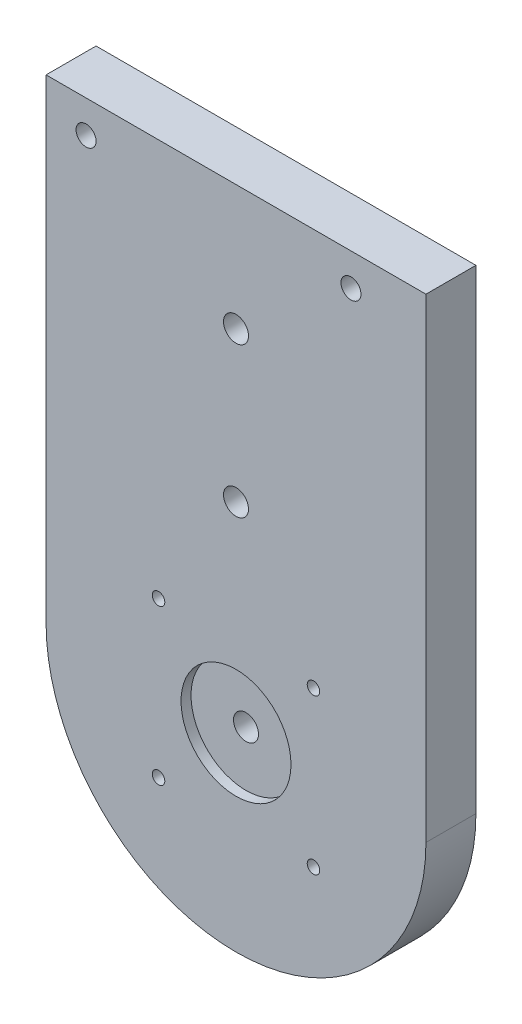
ISO-10303-21;
HEADER;
FILE_DESCRIPTION(('STEP AP214'),'2;1');
FILE_NAME('part.step','',(''),(''),'','','');
FILE_SCHEMA(('AUTOMOTIVE_DESIGN { 1 0 10303 214 1 1 1 1 }'));
ENDSEC;
DATA;
#1=APPLICATION_CONTEXT('core data for automotive mechanical design processes');
#2=APPLICATION_PROTOCOL_DEFINITION('international standard','automotive_design',2000,#1);
#3=PRODUCT_CONTEXT('',#1,'mechanical');
#4=PRODUCT('Part','Part','',(#3));
#5=PRODUCT_RELATED_PRODUCT_CATEGORY('part','',(#4));
#6=PRODUCT_DEFINITION_FORMATION('','',#4);
#7=PRODUCT_DEFINITION_CONTEXT('part definition',#1,'design');
#8=PRODUCT_DEFINITION('design','',#6,#7);
#9=PRODUCT_DEFINITION_SHAPE('','',#8);
#10=(LENGTH_UNIT() NAMED_UNIT(*) SI_UNIT(.MILLI.,.METRE.));
#11=(NAMED_UNIT(*) PLANE_ANGLE_UNIT() SI_UNIT($,.RADIAN.));
#12=(NAMED_UNIT(*) SI_UNIT($,.STERADIAN.) SOLID_ANGLE_UNIT());
#13=UNCERTAINTY_MEASURE_WITH_UNIT(LENGTH_MEASURE(1.E-05),#10,'distance_accuracy_value','');
#14=(GEOMETRIC_REPRESENTATION_CONTEXT(3) GLOBAL_UNCERTAINTY_ASSIGNED_CONTEXT((#13)) GLOBAL_UNIT_ASSIGNED_CONTEXT((#10,
#11,#12)) REPRESENTATION_CONTEXT('',''));
#15=CARTESIAN_POINT('',(0.,0.,0.));
#16=DIRECTION('',(0.,0.,1.));
#17=DIRECTION('',(1.,0.,0.));
#18=AXIS2_PLACEMENT_3D('',#15,#16,#17);
#19=CARTESIAN_POINT('',(0.,0.,10.));
#20=DIRECTION('',(0.,0.,-1.));
#21=DIRECTION('',(-1.,0.,0.));
#22=AXIS2_PLACEMENT_3D('',#19,#20,#21);
#23=CYLINDRICAL_SURFACE('',#22,2.5);
#24=CARTESIAN_POINT('',(0.,0.,0.));
#25=DIRECTION('',(0.,0.,1.));
#26=DIRECTION('',(1.,0.,0.));
#27=AXIS2_PLACEMENT_3D('',#24,#25,#26);
#28=CIRCLE('',#27,2.5);
#29=CARTESIAN_POINT('',(2.5,0.,0.));
#30=VERTEX_POINT('',#29);
#31=EDGE_CURVE('E151',#30,#30,#28,.T.);
#32=ORIENTED_EDGE('',*,*,#31,.F.);
#33=EDGE_LOOP('',(#32));
#34=FACE_BOUND('',#33,.T.);
#35=CARTESIAN_POINT('',(0.,0.,8.));
#36=DIRECTION('',(0.,0.,1.));
#37=DIRECTION('',(1.,0.,0.));
#38=AXIS2_PLACEMENT_3D('',#35,#36,#37);
#39=CIRCLE('',#38,2.5);
#40=CARTESIAN_POINT('',(2.5,0.,8.));
#41=VERTEX_POINT('',#40);
#42=EDGE_CURVE('E49',#41,#41,#39,.T.);
#43=ORIENTED_EDGE('',*,*,#42,.T.);
#44=EDGE_LOOP('',(#43));
#45=FACE_BOUND('',#44,.T.);
#46=ADVANCED_FACE('F45',(#34,#45),#23,.F.);
#47=CARTESIAN_POINT('',(0.,0.,10.));
#48=DIRECTION('',(0.,0.,1.));
#49=DIRECTION('',(1.,0.,0.));
#50=AXIS2_PLACEMENT_3D('',#47,#48,#49);
#51=PLANE('',#50);
#52=CARTESIAN_POINT('',(-30.,88.5,10.));
#53=DIRECTION('',(0.,0.,1.));
#54=DIRECTION('',(1.,0.,0.));
#55=AXIS2_PLACEMENT_3D('',#52,#53,#54);
#56=CIRCLE('',#55,2.);
#57=CARTESIAN_POINT('',(-28.,88.5,10.));
#58=VERTEX_POINT('',#57);
#59=EDGE_CURVE('E207',#58,#58,#56,.T.);
#60=ORIENTED_EDGE('',*,*,#59,.F.);
#61=EDGE_LOOP('',(#60));
#62=FACE_BOUND('',#61,.T.);
#63=CARTESIAN_POINT('',(23.,88.5,10.));
#64=DIRECTION('',(0.,0.,1.));
#65=DIRECTION('',(1.,0.,0.));
#66=AXIS2_PLACEMENT_3D('',#63,#64,#65);
#67=CIRCLE('',#66,2.);
#68=CARTESIAN_POINT('',(25.,88.5,10.));
#69=VERTEX_POINT('',#68);
#70=EDGE_CURVE('E203',#69,#69,#67,.T.);
#71=ORIENTED_EDGE('',*,*,#70,.F.);
#72=EDGE_LOOP('',(#71));
#73=FACE_BOUND('',#72,.T.);
#74=CARTESIAN_POINT('',(0.,0.,10.));
#75=DIRECTION('',(0.,0.,1.));
#76=DIRECTION('',(1.,0.,0.));
#77=AXIS2_PLACEMENT_3D('',#74,#75,#76);
#78=CIRCLE('',#77,11.);
#79=CARTESIAN_POINT('',(11.,0.,10.));
#80=VERTEX_POINT('',#79);
#81=EDGE_CURVE('E190',#80,#80,#78,.T.);
#82=ORIENTED_EDGE('',*,*,#81,.F.);
#83=EDGE_LOOP('',(#82));
#84=FACE_BOUND('',#83,.T.);
#85=CARTESIAN_POINT('',(15.5000000000003,-15.5,10.));
#86=DIRECTION('',(0.,0.,1.));
#87=DIRECTION('',(1.,0.,0.));
#88=AXIS2_PLACEMENT_3D('',#85,#86,#87);
#89=CIRCLE('',#88,1.25);
#90=CARTESIAN_POINT('',(16.7500000000003,-15.5,10.));
#91=VERTEX_POINT('',#90);
#92=EDGE_CURVE('E171',#91,#91,#89,.T.);
#93=ORIENTED_EDGE('',*,*,#92,.F.);
#94=EDGE_LOOP('',(#93));
#95=FACE_BOUND('',#94,.T.);
#96=CARTESIAN_POINT('',(-15.5,15.5,10.));
#97=DIRECTION('',(0.,0.,1.));
#98=DIRECTION('',(1.,0.,0.));
#99=AXIS2_PLACEMENT_3D('',#96,#97,#98);
#100=CIRCLE('',#99,1.25);
#101=CARTESIAN_POINT('',(-14.25,15.5,10.));
#102=VERTEX_POINT('',#101);
#103=EDGE_CURVE('E158',#102,#102,#100,.T.);
#104=ORIENTED_EDGE('',*,*,#103,.F.);
#105=EDGE_LOOP('',(#104));
#106=FACE_BOUND('',#105,.T.);
#107=CARTESIAN_POINT('',(0.,70.,10.));
#108=DIRECTION('',(0.,0.,1.));
#109=DIRECTION('',(1.,0.,0.));
#110=AXIS2_PLACEMENT_3D('',#107,#108,#109);
#111=CIRCLE('',#110,2.5);
#112=CARTESIAN_POINT('',(2.5,70.,10.));
#113=VERTEX_POINT('',#112);
#114=EDGE_CURVE('E143',#113,#113,#111,.T.);
#115=ORIENTED_EDGE('',*,*,#114,.F.);
#116=EDGE_LOOP('',(#115));
#117=FACE_BOUND('',#116,.T.);
#118=CARTESIAN_POINT('',(0.,0.,10.));
#119=DIRECTION('',(0.,0.,1.));
#120=DIRECTION('',(1.,0.,0.));
#121=AXIS2_PLACEMENT_3D('',#118,#119,#120);
#122=CIRCLE('',#121,38.);
#123=CARTESIAN_POINT('',(-38.,0.,10.));
#124=VERTEX_POINT('',#123);
#125=CARTESIAN_POINT('',(38.,0.,10.));
#126=VERTEX_POINT('',#125);
#127=EDGE_CURVE('E100',#124,#126,#122,.T.);
#128=ORIENTED_EDGE('',*,*,#127,.T.);
#129=DIRECTION('',(0.,1.,0.));
#130=VECTOR('',#129,1.);
#131=CARTESIAN_POINT('',(38.,0.,10.));
#132=LINE('',#131,#130);
#133=CARTESIAN_POINT('',(38.,95.,10.));
#134=VERTEX_POINT('',#133);
#135=EDGE_CURVE('E94',#126,#134,#132,.T.);
#136=ORIENTED_EDGE('',*,*,#135,.T.);
#137=DIRECTION('',(-1.,0.,0.));
#138=VECTOR('',#137,1.);
#139=CARTESIAN_POINT('',(-38.,95.,10.));
#140=LINE('',#139,#138);
#141=CARTESIAN_POINT('',(-38.,95.,10.));
#142=VERTEX_POINT('',#141);
#143=EDGE_CURVE('E98',#134,#142,#140,.T.);
#144=ORIENTED_EDGE('',*,*,#143,.T.);
#145=DIRECTION('',(0.,-1.,0.));
#146=VECTOR('',#145,1.);
#147=CARTESIAN_POINT('',(-38.,0.,10.));
#148=LINE('',#147,#146);
#149=EDGE_CURVE('E64',#142,#124,#148,.T.);
#150=ORIENTED_EDGE('',*,*,#149,.T.);
#151=EDGE_LOOP('',(#128,#136,#144,#150));
#152=FACE_BOUND('',#151,.T.);
#153=CARTESIAN_POINT('',(0.,40.,10.));
#154=DIRECTION('',(0.,0.,1.));
#155=DIRECTION('',(1.,0.,0.));
#156=AXIS2_PLACEMENT_3D('',#153,#154,#155);
#157=CIRCLE('',#156,2.5);
#158=CARTESIAN_POINT('',(2.5,40.,10.));
#159=VERTEX_POINT('',#158);
#160=EDGE_CURVE('E121',#159,#159,#157,.T.);
#161=ORIENTED_EDGE('',*,*,#160,.F.);
#162=EDGE_LOOP('',(#161));
#163=FACE_BOUND('',#162,.T.);
#164=CARTESIAN_POINT('',(15.5,15.5,10.));
#165=DIRECTION('',(0.,0.,1.));
#166=DIRECTION('',(1.,0.,0.));
#167=AXIS2_PLACEMENT_3D('',#164,#165,#166);
#168=CIRCLE('',#167,1.25);
#169=CARTESIAN_POINT('',(16.75,15.5,10.));
#170=VERTEX_POINT('',#169);
#171=EDGE_CURVE('E163',#170,#170,#168,.T.);
#172=ORIENTED_EDGE('',*,*,#171,.F.);
#173=EDGE_LOOP('',(#172));
#174=FACE_BOUND('',#173,.T.);
#175=CARTESIAN_POINT('',(-15.4999999999997,-15.5,10.));
#176=DIRECTION('',(0.,0.,1.));
#177=DIRECTION('',(1.,0.,0.));
#178=AXIS2_PLACEMENT_3D('',#175,#176,#177);
#179=CIRCLE('',#178,1.25);
#180=CARTESIAN_POINT('',(-14.2499999999997,-15.5,10.));
#181=VERTEX_POINT('',#180);
#182=EDGE_CURVE('E179',#181,#181,#179,.T.);
#183=ORIENTED_EDGE('',*,*,#182,.F.);
#184=EDGE_LOOP('',(#183));
#185=FACE_BOUND('',#184,.T.);
#186=ADVANCED_FACE('F95',(#62,#73,#84,#95,#106,#117,#152,#163,#174,#185),#51,.T.);
#187=CARTESIAN_POINT('',(0.,0.,0.));
#188=DIRECTION('',(0.,0.,1.));
#189=DIRECTION('',(1.,0.,0.));
#190=AXIS2_PLACEMENT_3D('',#187,#188,#189);
#191=PLANE('',#190);
#192=CARTESIAN_POINT('',(-30.,88.5,0.));
#193=DIRECTION('',(0.,0.,1.));
#194=DIRECTION('',(1.,0.,0.));
#195=AXIS2_PLACEMENT_3D('',#192,#193,#194);
#196=CIRCLE('',#195,2.);
#197=CARTESIAN_POINT('',(-28.,88.5,0.));
#198=VERTEX_POINT('',#197);
#199=EDGE_CURVE('E195',#198,#198,#196,.T.);
#200=ORIENTED_EDGE('',*,*,#199,.T.);
#201=EDGE_LOOP('',(#200));
#202=FACE_BOUND('',#201,.T.);
#203=CARTESIAN_POINT('',(23.,88.5,0.));
#204=DIRECTION('',(0.,0.,1.));
#205=DIRECTION('',(1.,0.,0.));
#206=AXIS2_PLACEMENT_3D('',#203,#204,#205);
#207=CIRCLE('',#206,2.);
#208=CARTESIAN_POINT('',(25.,88.5,0.));
#209=VERTEX_POINT('',#208);
#210=EDGE_CURVE('E199',#209,#209,#207,.T.);
#211=ORIENTED_EDGE('',*,*,#210,.T.);
#212=EDGE_LOOP('',(#211));
#213=FACE_BOUND('',#212,.T.);
#214=CARTESIAN_POINT('',(0.,0.,0.));
#215=DIRECTION('',(0.,0.,1.));
#216=DIRECTION('',(1.,0.,0.));
#217=AXIS2_PLACEMENT_3D('',#214,#215,#216);
#218=CIRCLE('',#217,38.);
#219=CARTESIAN_POINT('',(-38.,0.,0.));
#220=VERTEX_POINT('',#219);
#221=CARTESIAN_POINT('',(38.,0.,0.));
#222=VERTEX_POINT('',#221);
#223=EDGE_CURVE('E117',#220,#222,#218,.T.);
#224=ORIENTED_EDGE('',*,*,#223,.F.);
#225=DIRECTION('',(0.,-1.,0.));
#226=VECTOR('',#225,1.);
#227=CARTESIAN_POINT('',(-38.,0.,0.));
#228=LINE('',#227,#226);
#229=CARTESIAN_POINT('',(-38.,95.,0.));
#230=VERTEX_POINT('',#229);
#231=EDGE_CURVE('E87',#230,#220,#228,.T.);
#232=ORIENTED_EDGE('',*,*,#231,.F.);
#233=DIRECTION('',(-1.,0.,0.));
#234=VECTOR('',#233,1.);
#235=CARTESIAN_POINT('',(-38.,95.,0.));
#236=LINE('',#235,#234);
#237=CARTESIAN_POINT('',(38.,95.,0.));
#238=VERTEX_POINT('',#237);
#239=EDGE_CURVE('E81',#238,#230,#236,.T.);
#240=ORIENTED_EDGE('',*,*,#239,.F.);
#241=DIRECTION('',(0.,1.,0.));
#242=VECTOR('',#241,1.);
#243=CARTESIAN_POINT('',(38.,0.,0.));
#244=LINE('',#243,#242);
#245=EDGE_CURVE('E105',#222,#238,#244,.T.);
#246=ORIENTED_EDGE('',*,*,#245,.F.);
#247=EDGE_LOOP('',(#224,#232,#240,#246));
#248=FACE_BOUND('',#247,.T.);
#249=CARTESIAN_POINT('',(0.,40.,0.));
#250=DIRECTION('',(0.,0.,1.));
#251=DIRECTION('',(1.,0.,0.));
#252=AXIS2_PLACEMENT_3D('',#249,#250,#251);
#253=CIRCLE('',#252,2.5);
#254=CARTESIAN_POINT('',(2.5,40.,0.));
#255=VERTEX_POINT('',#254);
#256=EDGE_CURVE('E139',#255,#255,#253,.T.);
#257=ORIENTED_EDGE('',*,*,#256,.T.);
#258=EDGE_LOOP('',(#257));
#259=FACE_BOUND('',#258,.T.);
#260=CARTESIAN_POINT('',(0.,70.,0.));
#261=DIRECTION('',(0.,0.,1.));
#262=DIRECTION('',(1.,0.,0.));
#263=AXIS2_PLACEMENT_3D('',#260,#261,#262);
#264=CIRCLE('',#263,2.5);
#265=CARTESIAN_POINT('',(2.5,70.,0.));
#266=VERTEX_POINT('',#265);
#267=EDGE_CURVE('E147',#266,#266,#264,.T.);
#268=ORIENTED_EDGE('',*,*,#267,.T.);
#269=EDGE_LOOP('',(#268));
#270=FACE_BOUND('',#269,.T.);
#271=ORIENTED_EDGE('',*,*,#31,.T.);
#272=EDGE_LOOP('',(#271));
#273=FACE_BOUND('',#272,.T.);
#274=CARTESIAN_POINT('',(-15.5,15.5,0.));
#275=DIRECTION('',(0.,0.,1.));
#276=DIRECTION('',(1.,0.,0.));
#277=AXIS2_PLACEMENT_3D('',#274,#275,#276);
#278=CIRCLE('',#277,1.25);
#279=CARTESIAN_POINT('',(-14.25,15.5,0.));
#280=VERTEX_POINT('',#279);
#281=EDGE_CURVE('E159',#280,#280,#278,.T.);
#282=ORIENTED_EDGE('',*,*,#281,.T.);
#283=EDGE_LOOP('',(#282));
#284=FACE_BOUND('',#283,.T.);
#285=CARTESIAN_POINT('',(15.5,15.5,0.));
#286=DIRECTION('',(0.,0.,1.));
#287=DIRECTION('',(1.,0.,0.));
#288=AXIS2_PLACEMENT_3D('',#285,#286,#287);
#289=CIRCLE('',#288,1.25);
#290=CARTESIAN_POINT('',(16.75,15.5,0.));
#291=VERTEX_POINT('',#290);
#292=EDGE_CURVE('E167',#291,#291,#289,.T.);
#293=ORIENTED_EDGE('',*,*,#292,.T.);
#294=EDGE_LOOP('',(#293));
#295=FACE_BOUND('',#294,.T.);
#296=CARTESIAN_POINT('',(15.5000000000003,-15.5,0.));
#297=DIRECTION('',(0.,0.,1.));
#298=DIRECTION('',(1.,0.,0.));
#299=AXIS2_PLACEMENT_3D('',#296,#297,#298);
#300=CIRCLE('',#299,1.25);
#301=CARTESIAN_POINT('',(16.7500000000003,-15.5,0.));
#302=VERTEX_POINT('',#301);
#303=EDGE_CURVE('E175',#302,#302,#300,.T.);
#304=ORIENTED_EDGE('',*,*,#303,.T.);
#305=EDGE_LOOP('',(#304));
#306=FACE_BOUND('',#305,.T.);
#307=CARTESIAN_POINT('',(-15.4999999999997,-15.5,0.));
#308=DIRECTION('',(0.,0.,1.));
#309=DIRECTION('',(1.,0.,0.));
#310=AXIS2_PLACEMENT_3D('',#307,#308,#309);
#311=CIRCLE('',#310,1.25);
#312=CARTESIAN_POINT('',(-14.2499999999997,-15.5,0.));
#313=VERTEX_POINT('',#312);
#314=EDGE_CURVE('E183',#313,#313,#311,.T.);
#315=ORIENTED_EDGE('',*,*,#314,.T.);
#316=EDGE_LOOP('',(#315));
#317=FACE_BOUND('',#316,.T.);
#318=ADVANCED_FACE('F134',(#202,#213,#248,#259,#270,#273,#284,#295,#306,#317),#191,.F.);
#319=CARTESIAN_POINT('',(0.,0.,10.));
#320=DIRECTION('',(0.,0.,-1.));
#321=DIRECTION('',(-1.,0.,0.));
#322=AXIS2_PLACEMENT_3D('',#319,#320,#321);
#323=CYLINDRICAL_SURFACE('',#322,38.);
#324=ORIENTED_EDGE('',*,*,#223,.T.);
#325=DIRECTION('',(0.,0.,-1.));
#326=VECTOR('',#325,1.);
#327=CARTESIAN_POINT('',(38.,0.,10.));
#328=LINE('',#327,#326);
#329=EDGE_CURVE('E11',#126,#222,#328,.T.);
#330=ORIENTED_EDGE('',*,*,#329,.F.);
#331=ORIENTED_EDGE('',*,*,#127,.F.);
#332=DIRECTION('',(0.,0.,-1.));
#333=VECTOR('',#332,1.);
#334=CARTESIAN_POINT('',(-38.,0.,10.));
#335=LINE('',#334,#333);
#336=EDGE_CURVE('E113',#124,#220,#335,.T.);
#337=ORIENTED_EDGE('',*,*,#336,.T.);
#338=EDGE_LOOP('',(#324,#330,#331,#337));
#339=FACE_BOUND('',#338,.T.);
#340=ADVANCED_FACE('F47',(#339),#323,.T.);
#341=CARTESIAN_POINT('',(38.,0.,10.));
#342=DIRECTION('',(-1.,0.,0.));
#343=DIRECTION('',(0.,0.,1.));
#344=AXIS2_PLACEMENT_3D('',#341,#342,#343);
#345=PLANE('',#344);
#346=ORIENTED_EDGE('',*,*,#245,.T.);
#347=DIRECTION('',(0.,0.,-1.));
#348=VECTOR('',#347,1.);
#349=CARTESIAN_POINT('',(38.,95.,10.));
#350=LINE('',#349,#348);
#351=EDGE_CURVE('E56',#134,#238,#350,.T.);
#352=ORIENTED_EDGE('',*,*,#351,.F.);
#353=ORIENTED_EDGE('',*,*,#135,.F.);
#354=ORIENTED_EDGE('',*,*,#329,.T.);
#355=EDGE_LOOP('',(#346,#352,#353,#354));
#356=FACE_BOUND('',#355,.T.);
#357=ADVANCED_FACE('F104',(#356),#345,.F.);
#358=CARTESIAN_POINT('',(-38.,95.,10.));
#359=DIRECTION('',(0.,-1.,0.));
#360=DIRECTION('',(0.,0.,-1.));
#361=AXIS2_PLACEMENT_3D('',#358,#359,#360);
#362=PLANE('',#361);
#363=ORIENTED_EDGE('',*,*,#239,.T.);
#364=DIRECTION('',(0.,0.,-1.));
#365=VECTOR('',#364,1.);
#366=CARTESIAN_POINT('',(-38.,95.,10.));
#367=LINE('',#366,#365);
#368=EDGE_CURVE('E107',#142,#230,#367,.T.);
#369=ORIENTED_EDGE('',*,*,#368,.F.);
#370=ORIENTED_EDGE('',*,*,#143,.F.);
#371=ORIENTED_EDGE('',*,*,#351,.T.);
#372=EDGE_LOOP('',(#363,#369,#370,#371));
#373=FACE_BOUND('',#372,.T.);
#374=ADVANCED_FACE('F109',(#373),#362,.F.);
#375=CARTESIAN_POINT('',(-38.,0.,10.));
#376=DIRECTION('',(1.,0.,0.));
#377=DIRECTION('',(0.,0.,-1.));
#378=AXIS2_PLACEMENT_3D('',#375,#376,#377);
#379=PLANE('',#378);
#380=ORIENTED_EDGE('',*,*,#231,.T.);
#381=ORIENTED_EDGE('',*,*,#336,.F.);
#382=ORIENTED_EDGE('',*,*,#149,.F.);
#383=ORIENTED_EDGE('',*,*,#368,.T.);
#384=EDGE_LOOP('',(#380,#381,#382,#383));
#385=FACE_BOUND('',#384,.T.);
#386=ADVANCED_FACE('F131',(#385),#379,.F.);
#387=CARTESIAN_POINT('',(0.,40.,10.));
#388=DIRECTION('',(0.,0.,-1.));
#389=DIRECTION('',(-1.,0.,0.));
#390=AXIS2_PLACEMENT_3D('',#387,#388,#389);
#391=CYLINDRICAL_SURFACE('',#390,2.5);
#392=ORIENTED_EDGE('',*,*,#160,.T.);
#393=EDGE_LOOP('',(#392));
#394=FACE_BOUND('',#393,.T.);
#395=ORIENTED_EDGE('',*,*,#256,.F.);
#396=EDGE_LOOP('',(#395));
#397=FACE_BOUND('',#396,.T.);
#398=ADVANCED_FACE('F241',(#394,#397),#391,.F.);
#399=CARTESIAN_POINT('',(0.,70.,10.));
#400=DIRECTION('',(0.,0.,-1.));
#401=DIRECTION('',(-1.,0.,0.));
#402=AXIS2_PLACEMENT_3D('',#399,#400,#401);
#403=CYLINDRICAL_SURFACE('',#402,2.5);
#404=ORIENTED_EDGE('',*,*,#114,.T.);
#405=EDGE_LOOP('',(#404));
#406=FACE_BOUND('',#405,.T.);
#407=ORIENTED_EDGE('',*,*,#267,.F.);
#408=EDGE_LOOP('',(#407));
#409=FACE_BOUND('',#408,.T.);
#410=ADVANCED_FACE('F237',(#406,#409),#403,.F.);
#411=CARTESIAN_POINT('',(-15.5,15.5,10.));
#412=DIRECTION('',(0.,0.,-1.));
#413=DIRECTION('',(-1.,0.,0.));
#414=AXIS2_PLACEMENT_3D('',#411,#412,#413);
#415=CYLINDRICAL_SURFACE('',#414,1.25);
#416=ORIENTED_EDGE('',*,*,#103,.T.);
#417=EDGE_LOOP('',(#416));
#418=FACE_BOUND('',#417,.T.);
#419=ORIENTED_EDGE('',*,*,#281,.F.);
#420=EDGE_LOOP('',(#419));
#421=FACE_BOUND('',#420,.T.);
#422=ADVANCED_FACE('F240',(#418,#421),#415,.F.);
#423=CARTESIAN_POINT('',(15.5,15.5,10.));
#424=DIRECTION('',(0.,0.,-1.));
#425=DIRECTION('',(-1.,0.,0.));
#426=AXIS2_PLACEMENT_3D('',#423,#424,#425);
#427=CYLINDRICAL_SURFACE('',#426,1.25);
#428=ORIENTED_EDGE('',*,*,#171,.T.);
#429=EDGE_LOOP('',(#428));
#430=FACE_BOUND('',#429,.T.);
#431=ORIENTED_EDGE('',*,*,#292,.F.);
#432=EDGE_LOOP('',(#431));
#433=FACE_BOUND('',#432,.T.);
#434=ADVANCED_FACE('F272',(#430,#433),#427,.F.);
#435=CARTESIAN_POINT('',(15.5000000000003,-15.5,10.));
#436=DIRECTION('',(0.,0.,-1.));
#437=DIRECTION('',(-1.,0.,0.));
#438=AXIS2_PLACEMENT_3D('',#435,#436,#437);
#439=CYLINDRICAL_SURFACE('',#438,1.25);
#440=ORIENTED_EDGE('',*,*,#92,.T.);
#441=EDGE_LOOP('',(#440));
#442=FACE_BOUND('',#441,.T.);
#443=ORIENTED_EDGE('',*,*,#303,.F.);
#444=EDGE_LOOP('',(#443));
#445=FACE_BOUND('',#444,.T.);
#446=ADVANCED_FACE('F261',(#442,#445),#439,.F.);
#447=CARTESIAN_POINT('',(-15.4999999999997,-15.5,10.));
#448=DIRECTION('',(0.,0.,-1.));
#449=DIRECTION('',(-1.,0.,0.));
#450=AXIS2_PLACEMENT_3D('',#447,#448,#449);
#451=CYLINDRICAL_SURFACE('',#450,1.25);
#452=ORIENTED_EDGE('',*,*,#182,.T.);
#453=EDGE_LOOP('',(#452));
#454=FACE_BOUND('',#453,.T.);
#455=ORIENTED_EDGE('',*,*,#314,.F.);
#456=EDGE_LOOP('',(#455));
#457=FACE_BOUND('',#456,.T.);
#458=ADVANCED_FACE('F258',(#454,#457),#451,.F.);
#459=CARTESIAN_POINT('',(0.,0.,8.));
#460=DIRECTION('',(0.,0.,1.));
#461=DIRECTION('',(1.,0.,0.));
#462=AXIS2_PLACEMENT_3D('',#459,#460,#461);
#463=CYLINDRICAL_SURFACE('',#462,11.);
#464=CARTESIAN_POINT('',(0.,0.,8.));
#465=DIRECTION('',(0.,0.,1.));
#466=DIRECTION('',(1.,0.,0.));
#467=AXIS2_PLACEMENT_3D('',#464,#465,#466);
#468=CIRCLE('',#467,11.);
#469=CARTESIAN_POINT('',(11.,0.,8.));
#470=VERTEX_POINT('',#469);
#471=EDGE_CURVE('E194',#470,#470,#468,.T.);
#472=ORIENTED_EDGE('',*,*,#471,.F.);
#473=EDGE_LOOP('',(#472));
#474=FACE_BOUND('',#473,.T.);
#475=ORIENTED_EDGE('',*,*,#81,.T.);
#476=EDGE_LOOP('',(#475));
#477=FACE_BOUND('',#476,.T.);
#478=ADVANCED_FACE('F260',(#474,#477),#463,.F.);
#479=CARTESIAN_POINT('',(0.,0.,8.));
#480=DIRECTION('',(0.,0.,1.));
#481=DIRECTION('',(1.,0.,0.));
#482=AXIS2_PLACEMENT_3D('',#479,#480,#481);
#483=PLANE('',#482);
#484=ORIENTED_EDGE('',*,*,#42,.F.);
#485=EDGE_LOOP('',(#484));
#486=FACE_BOUND('',#485,.T.);
#487=ORIENTED_EDGE('',*,*,#471,.T.);
#488=EDGE_LOOP('',(#487));
#489=FACE_BOUND('',#488,.T.);
#490=ADVANCED_FACE('F269',(#486,#489),#483,.T.);
#491=CARTESIAN_POINT('',(23.,88.5,0.));
#492=DIRECTION('',(0.,0.,1.));
#493=DIRECTION('',(1.,0.,0.));
#494=AXIS2_PLACEMENT_3D('',#491,#492,#493);
#495=CYLINDRICAL_SURFACE('',#494,2.);
#496=ORIENTED_EDGE('',*,*,#210,.F.);
#497=EDGE_LOOP('',(#496));
#498=FACE_BOUND('',#497,.T.);
#499=ORIENTED_EDGE('',*,*,#70,.T.);
#500=EDGE_LOOP('',(#499));
#501=FACE_BOUND('',#500,.T.);
#502=ADVANCED_FACE('F220',(#498,#501),#495,.F.);
#503=CARTESIAN_POINT('',(-30.,88.5,0.));
#504=DIRECTION('',(0.,0.,1.));
#505=DIRECTION('',(1.,0.,0.));
#506=AXIS2_PLACEMENT_3D('',#503,#504,#505);
#507=CYLINDRICAL_SURFACE('',#506,2.);
#508=ORIENTED_EDGE('',*,*,#199,.F.);
#509=EDGE_LOOP('',(#508));
#510=FACE_BOUND('',#509,.T.);
#511=ORIENTED_EDGE('',*,*,#59,.T.);
#512=EDGE_LOOP('',(#511));
#513=FACE_BOUND('',#512,.T.);
#514=ADVANCED_FACE('F217',(#510,#513),#507,.F.);
#515=CLOSED_SHELL('',(#46,#186,#318,#340,#357,#374,#386,#398,#410,#422,#434,#446,#458,#478,#490,
#502,#514));
#516=MANIFOLD_SOLID_BREP('B2',#515);
#517=ADVANCED_BREP_SHAPE_REPRESENTATION('',(#18,#516),#14);
#518=SHAPE_DEFINITION_REPRESENTATION(#9,#517);
ENDSEC;
END-ISO-10303-21;
